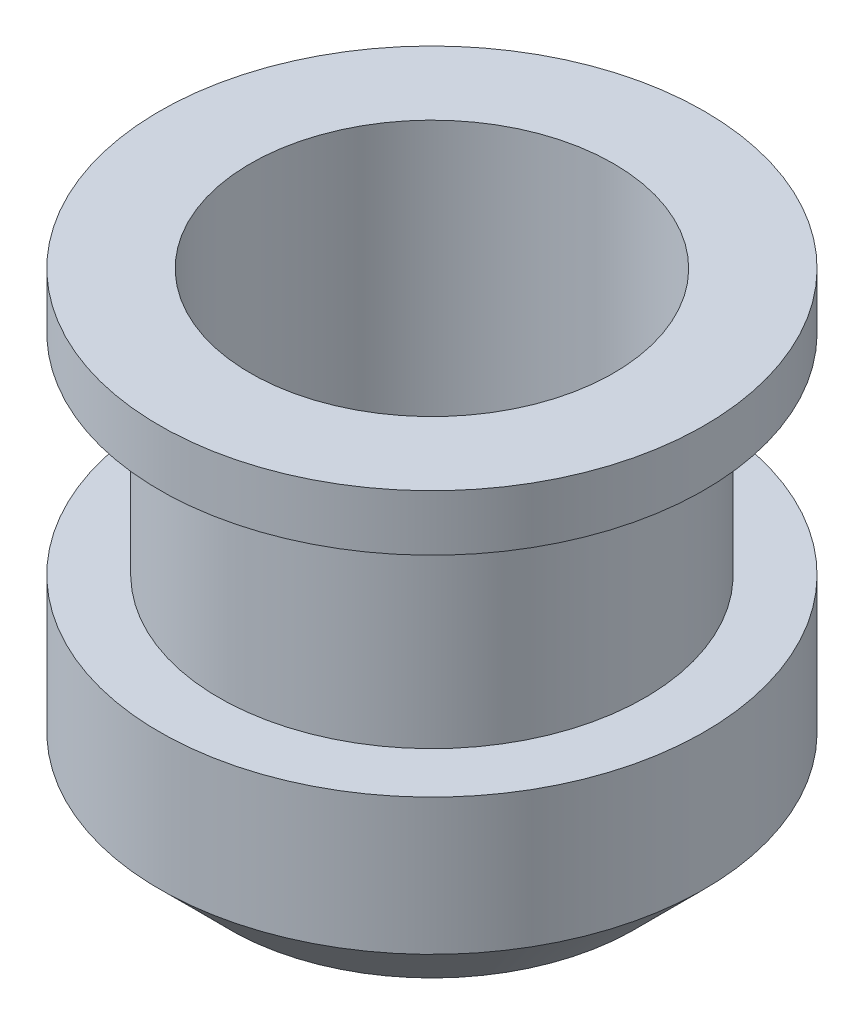
ISO-10303-21;
HEADER;
FILE_DESCRIPTION(('STEP AP214'),'2;1');
FILE_NAME('part.step','',(''),(''),'','','');
FILE_SCHEMA(('AUTOMOTIVE_DESIGN { 1 0 10303 214 1 1 1 1 }'));
ENDSEC;
DATA;
#1=APPLICATION_CONTEXT('core data for automotive mechanical design processes');
#2=APPLICATION_PROTOCOL_DEFINITION('international standard','automotive_design',2000,#1);
#3=PRODUCT_CONTEXT('',#1,'mechanical');
#4=PRODUCT('Part','Part','',(#3));
#5=PRODUCT_RELATED_PRODUCT_CATEGORY('part','',(#4));
#6=PRODUCT_DEFINITION_FORMATION('','',#4);
#7=PRODUCT_DEFINITION_CONTEXT('part definition',#1,'design');
#8=PRODUCT_DEFINITION('design','',#6,#7);
#9=PRODUCT_DEFINITION_SHAPE('','',#8);
#10=(LENGTH_UNIT() NAMED_UNIT(*) SI_UNIT(.MILLI.,.METRE.));
#11=(NAMED_UNIT(*) PLANE_ANGLE_UNIT() SI_UNIT($,.RADIAN.));
#12=(NAMED_UNIT(*) SI_UNIT($,.STERADIAN.) SOLID_ANGLE_UNIT());
#13=UNCERTAINTY_MEASURE_WITH_UNIT(LENGTH_MEASURE(1.E-05),#10,'distance_accuracy_value','');
#14=(GEOMETRIC_REPRESENTATION_CONTEXT(3) GLOBAL_UNCERTAINTY_ASSIGNED_CONTEXT((#13)) GLOBAL_UNIT_ASSIGNED_CONTEXT((#10,
#11,#12)) REPRESENTATION_CONTEXT('',''));
#15=CARTESIAN_POINT('',(0.,0.,0.));
#16=DIRECTION('',(0.,0.,1.));
#17=DIRECTION('',(1.,0.,0.));
#18=AXIS2_PLACEMENT_3D('',#15,#16,#17);
#19=CARTESIAN_POINT('',(0.,0.,0.));
#20=DIRECTION('',(0.,-1.,0.));
#21=DIRECTION('',(0.,0.,-1.));
#22=AXIS2_PLACEMENT_3D('',#19,#20,#21);
#23=CYLINDRICAL_SURFACE('',#22,2.6);
#24=CARTESIAN_POINT('',(0.,0.,0.));
#25=DIRECTION('',(0.,-1.,0.));
#26=DIRECTION('',(0.,0.,-1.));
#27=AXIS2_PLACEMENT_3D('',#24,#25,#26);
#28=CIRCLE('',#27,2.6);
#29=CARTESIAN_POINT('',(0.,0.,-2.6));
#30=VERTEX_POINT('',#29);
#31=EDGE_CURVE('E10',#30,#30,#28,.T.);
#32=ORIENTED_EDGE('',*,*,#31,.F.);
#33=EDGE_LOOP('',(#32));
#34=FACE_BOUND('',#33,.T.);
#35=CARTESIAN_POINT('',(0.,-6.75,0.));
#36=DIRECTION('',(0.,-1.,0.));
#37=DIRECTION('',(0.,0.,-1.));
#38=AXIS2_PLACEMENT_3D('',#35,#36,#37);
#39=CIRCLE('',#38,2.6);
#40=CARTESIAN_POINT('',(0.,-6.75,-2.6));
#41=VERTEX_POINT('',#40);
#42=EDGE_CURVE('E61',#41,#41,#39,.T.);
#43=ORIENTED_EDGE('',*,*,#42,.T.);
#44=EDGE_LOOP('',(#43));
#45=FACE_BOUND('',#44,.T.);
#46=ADVANCED_FACE('F30',(#34,#45),#23,.F.);
#47=CARTESIAN_POINT('',(-2.6,0.,0.));
#48=DIRECTION('',(0.,-1.,0.));
#49=DIRECTION('',(0.,0.,-1.));
#50=AXIS2_PLACEMENT_3D('',#47,#48,#49);
#51=PLANE('',#50);
#52=CARTESIAN_POINT('',(0.,0.,0.));
#53=DIRECTION('',(0.,-1.,0.));
#54=DIRECTION('',(0.,0.,-1.));
#55=AXIS2_PLACEMENT_3D('',#52,#53,#54);
#56=CIRCLE('',#55,3.9);
#57=CARTESIAN_POINT('',(0.,0.,-3.9));
#58=VERTEX_POINT('',#57);
#59=EDGE_CURVE('E36',#58,#58,#56,.T.);
#60=ORIENTED_EDGE('',*,*,#59,.F.);
#61=EDGE_LOOP('',(#60));
#62=FACE_BOUND('',#61,.T.);
#63=ORIENTED_EDGE('',*,*,#31,.T.);
#64=EDGE_LOOP('',(#63));
#65=FACE_BOUND('',#64,.T.);
#66=ADVANCED_FACE('F104',(#62,#65),#51,.F.);
#67=CARTESIAN_POINT('',(0.,0.,0.));
#68=DIRECTION('',(0.,-1.,0.));
#69=DIRECTION('',(0.,0.,-1.));
#70=AXIS2_PLACEMENT_3D('',#67,#68,#69);
#71=CYLINDRICAL_SURFACE('',#70,3.9);
#72=CARTESIAN_POINT('',(0.,-0.799999999999999,0.));
#73=DIRECTION('',(0.,-1.,0.));
#74=DIRECTION('',(0.,0.,-1.));
#75=AXIS2_PLACEMENT_3D('',#72,#73,#74);
#76=CIRCLE('',#75,3.9);
#77=CARTESIAN_POINT('',(0.,-0.799999999999999,-3.9));
#78=VERTEX_POINT('',#77);
#79=EDGE_CURVE('E40',#78,#78,#76,.T.);
#80=ORIENTED_EDGE('',*,*,#79,.F.);
#81=EDGE_LOOP('',(#80));
#82=FACE_BOUND('',#81,.T.);
#83=ORIENTED_EDGE('',*,*,#59,.T.);
#84=EDGE_LOOP('',(#83));
#85=FACE_BOUND('',#84,.T.);
#86=ADVANCED_FACE('F99',(#82,#85),#71,.T.);
#87=CARTESIAN_POINT('',(-3.9,-0.799999999999999,0.));
#88=DIRECTION('',(0.,1.,0.));
#89=DIRECTION('',(0.,0.,1.));
#90=AXIS2_PLACEMENT_3D('',#87,#88,#89);
#91=PLANE('',#90);
#92=CARTESIAN_POINT('',(0.,-0.799999999999999,0.));
#93=DIRECTION('',(0.,-1.,0.));
#94=DIRECTION('',(0.,0.,-1.));
#95=AXIS2_PLACEMENT_3D('',#92,#93,#94);
#96=CIRCLE('',#95,3.05);
#97=CARTESIAN_POINT('',(0.,-0.799999999999999,-3.05));
#98=VERTEX_POINT('',#97);
#99=EDGE_CURVE('E44',#98,#98,#96,.T.);
#100=ORIENTED_EDGE('',*,*,#99,.F.);
#101=EDGE_LOOP('',(#100));
#102=FACE_BOUND('',#101,.T.);
#103=ORIENTED_EDGE('',*,*,#79,.T.);
#104=EDGE_LOOP('',(#103));
#105=FACE_BOUND('',#104,.T.);
#106=ADVANCED_FACE('F93',(#102,#105),#91,.F.);
#107=CARTESIAN_POINT('',(0.,0.,0.));
#108=DIRECTION('',(0.,-1.,0.));
#109=DIRECTION('',(0.,0.,-1.));
#110=AXIS2_PLACEMENT_3D('',#107,#108,#109);
#111=CYLINDRICAL_SURFACE('',#110,3.05);
#112=CARTESIAN_POINT('',(0.,-3.8,0.));
#113=DIRECTION('',(0.,-1.,0.));
#114=DIRECTION('',(0.,0.,-1.));
#115=AXIS2_PLACEMENT_3D('',#112,#113,#114);
#116=CIRCLE('',#115,3.05);
#117=CARTESIAN_POINT('',(0.,-3.8,-3.05));
#118=VERTEX_POINT('',#117);
#119=EDGE_CURVE('E49',#118,#118,#116,.T.);
#120=ORIENTED_EDGE('',*,*,#119,.F.);
#121=EDGE_LOOP('',(#120));
#122=FACE_BOUND('',#121,.T.);
#123=ORIENTED_EDGE('',*,*,#99,.T.);
#124=EDGE_LOOP('',(#123));
#125=FACE_BOUND('',#124,.T.);
#126=ADVANCED_FACE('F87',(#122,#125),#111,.T.);
#127=CARTESIAN_POINT('',(-3.05,-3.8,0.));
#128=DIRECTION('',(0.,-1.,0.));
#129=DIRECTION('',(0.,0.,-1.));
#130=AXIS2_PLACEMENT_3D('',#127,#128,#129);
#131=PLANE('',#130);
#132=CARTESIAN_POINT('',(0.,-3.8,0.));
#133=DIRECTION('',(0.,-1.,0.));
#134=DIRECTION('',(0.,0.,-1.));
#135=AXIS2_PLACEMENT_3D('',#132,#133,#134);
#136=CIRCLE('',#135,3.9);
#137=CARTESIAN_POINT('',(0.,-3.8,-3.9));
#138=VERTEX_POINT('',#137);
#139=EDGE_CURVE('E52',#138,#138,#136,.T.);
#140=ORIENTED_EDGE('',*,*,#139,.F.);
#141=EDGE_LOOP('',(#140));
#142=FACE_BOUND('',#141,.T.);
#143=ORIENTED_EDGE('',*,*,#119,.T.);
#144=EDGE_LOOP('',(#143));
#145=FACE_BOUND('',#144,.T.);
#146=ADVANCED_FACE('F81',(#142,#145),#131,.F.);
#147=CARTESIAN_POINT('',(0.,0.,0.));
#148=DIRECTION('',(0.,-1.,0.));
#149=DIRECTION('',(0.,0.,-1.));
#150=AXIS2_PLACEMENT_3D('',#147,#148,#149);
#151=CYLINDRICAL_SURFACE('',#150,3.9);
#152=CARTESIAN_POINT('',(0.,-5.75,0.));
#153=DIRECTION('',(0.,-1.,0.));
#154=DIRECTION('',(0.,0.,-1.));
#155=AXIS2_PLACEMENT_3D('',#152,#153,#154);
#156=CIRCLE('',#155,3.9);
#157=CARTESIAN_POINT('',(0.,-5.75,-3.9));
#158=VERTEX_POINT('',#157);
#159=EDGE_CURVE('E55',#158,#158,#156,.T.);
#160=ORIENTED_EDGE('',*,*,#159,.F.);
#161=EDGE_LOOP('',(#160));
#162=FACE_BOUND('',#161,.T.);
#163=ORIENTED_EDGE('',*,*,#139,.T.);
#164=EDGE_LOOP('',(#163));
#165=FACE_BOUND('',#164,.T.);
#166=ADVANCED_FACE('F75',(#162,#165),#151,.T.);
#167=CARTESIAN_POINT('',(0.,-5.75,0.));
#168=DIRECTION('',(0.,1.,0.));
#169=DIRECTION('',(0.,0.,1.));
#170=AXIS2_PLACEMENT_3D('',#167,#168,#169);
#171=CONICAL_SURFACE('',#170,3.9,0.785398163397449);
#172=CARTESIAN_POINT('',(0.,-6.75,0.));
#173=DIRECTION('',(0.,-1.,0.));
#174=DIRECTION('',(0.,0.,-1.));
#175=AXIS2_PLACEMENT_3D('',#172,#173,#174);
#176=CIRCLE('',#175,2.9);
#177=CARTESIAN_POINT('',(0.,-6.75,-2.9));
#178=VERTEX_POINT('',#177);
#179=EDGE_CURVE('E58',#178,#178,#176,.T.);
#180=ORIENTED_EDGE('',*,*,#179,.F.);
#181=EDGE_LOOP('',(#180));
#182=FACE_BOUND('',#181,.T.);
#183=ORIENTED_EDGE('',*,*,#159,.T.);
#184=EDGE_LOOP('',(#183));
#185=FACE_BOUND('',#184,.T.);
#186=ADVANCED_FACE('F69',(#182,#185),#171,.T.);
#187=CARTESIAN_POINT('',(-2.6,-6.75,0.));
#188=DIRECTION('',(0.,1.,0.));
#189=DIRECTION('',(0.,0.,1.));
#190=AXIS2_PLACEMENT_3D('',#187,#188,#189);
#191=PLANE('',#190);
#192=ORIENTED_EDGE('',*,*,#42,.F.);
#193=EDGE_LOOP('',(#192));
#194=FACE_BOUND('',#193,.T.);
#195=ORIENTED_EDGE('',*,*,#179,.T.);
#196=EDGE_LOOP('',(#195));
#197=FACE_BOUND('',#196,.T.);
#198=ADVANCED_FACE('F66',(#194,#197),#191,.F.);
#199=CLOSED_SHELL('',(#46,#66,#86,#106,#126,#146,#166,#186,#198));
#200=MANIFOLD_SOLID_BREP('B2',#199);
#201=ADVANCED_BREP_SHAPE_REPRESENTATION('',(#18,#200),#14);
#202=SHAPE_DEFINITION_REPRESENTATION(#9,#201);
ENDSEC;
END-ISO-10303-21;
